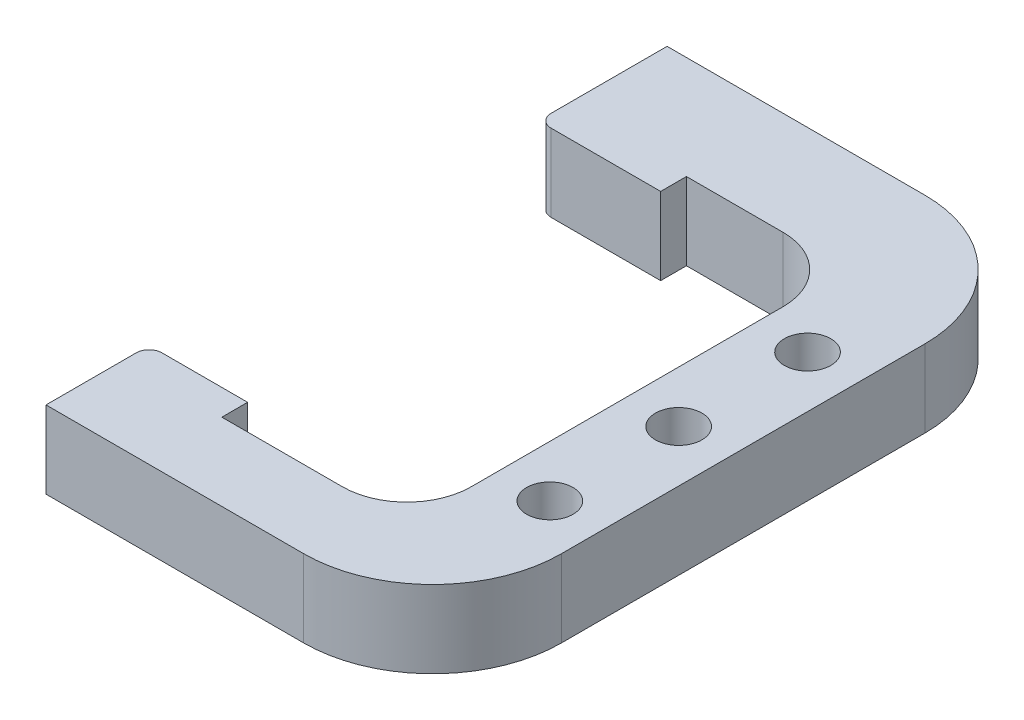
ISO-10303-21;
HEADER;
FILE_DESCRIPTION(('STEP AP214'),'2;1');
FILE_NAME('part.step','',(''),(''),'','','');
FILE_SCHEMA(('AUTOMOTIVE_DESIGN { 1 0 10303 214 1 1 1 1 }'));
ENDSEC;
DATA;
#1=APPLICATION_CONTEXT('core data for automotive mechanical design processes');
#2=APPLICATION_PROTOCOL_DEFINITION('international standard','automotive_design',2000,#1);
#3=PRODUCT_CONTEXT('',#1,'mechanical');
#4=PRODUCT('Part','Part','',(#3));
#5=PRODUCT_RELATED_PRODUCT_CATEGORY('part','',(#4));
#6=PRODUCT_DEFINITION_FORMATION('','',#4);
#7=PRODUCT_DEFINITION_CONTEXT('part definition',#1,'design');
#8=PRODUCT_DEFINITION('design','',#6,#7);
#9=PRODUCT_DEFINITION_SHAPE('','',#8);
#10=(LENGTH_UNIT() NAMED_UNIT(*) SI_UNIT(.MILLI.,.METRE.));
#11=(NAMED_UNIT(*) PLANE_ANGLE_UNIT() SI_UNIT($,.RADIAN.));
#12=(NAMED_UNIT(*) SI_UNIT($,.STERADIAN.) SOLID_ANGLE_UNIT());
#13=UNCERTAINTY_MEASURE_WITH_UNIT(LENGTH_MEASURE(1.E-05),#10,'distance_accuracy_value','');
#14=(GEOMETRIC_REPRESENTATION_CONTEXT(3) GLOBAL_UNCERTAINTY_ASSIGNED_CONTEXT((#13)) GLOBAL_UNIT_ASSIGNED_CONTEXT((#10,
#11,#12)) REPRESENTATION_CONTEXT('',''));
#15=CARTESIAN_POINT('',(0.,0.,0.));
#16=DIRECTION('',(0.,0.,1.));
#17=DIRECTION('',(1.,0.,0.));
#18=AXIS2_PLACEMENT_3D('',#15,#16,#17);
#19=CARTESIAN_POINT('',(30.,6.,36.6));
#20=DIRECTION('',(0.,0.,-1.));
#21=DIRECTION('',(-1.,0.,0.));
#22=AXIS2_PLACEMENT_3D('',#19,#20,#21);
#23=PLANE('',#22);
#24=DIRECTION('',(1.,0.,0.));
#25=VECTOR('',#24,1.);
#26=CARTESIAN_POINT('',(30.,0.,36.6));
#27=LINE('',#26,#25);
#28=CARTESIAN_POINT('',(0.,0.,36.6));
#29=VERTEX_POINT('',#28);
#30=CARTESIAN_POINT('',(20.,0.,36.6));
#31=VERTEX_POINT('',#30);
#32=EDGE_CURVE('E207',#29,#31,#27,.T.);
#33=ORIENTED_EDGE('',*,*,#32,.T.);
#34=DIRECTION('',(0.,-1.,0.));
#35=VECTOR('',#34,1.);
#36=CARTESIAN_POINT('',(20.,6.,36.6));
#37=LINE('',#36,#35);
#38=CARTESIAN_POINT('',(20.,6.,36.6));
#39=VERTEX_POINT('',#38);
#40=EDGE_CURVE('E262',#31,#39,#37,.F.);
#41=ORIENTED_EDGE('',*,*,#40,.T.);
#42=DIRECTION('',(1.,0.,0.));
#43=VECTOR('',#42,1.);
#44=CARTESIAN_POINT('',(30.,6.,36.6));
#45=LINE('',#44,#43);
#46=CARTESIAN_POINT('',(0.,6.,36.6));
#47=VERTEX_POINT('',#46);
#48=EDGE_CURVE('E235',#47,#39,#45,.T.);
#49=ORIENTED_EDGE('',*,*,#48,.F.);
#50=DIRECTION('',(0.,-1.,0.));
#51=VECTOR('',#50,1.);
#52=CARTESIAN_POINT('',(0.,6.,36.6));
#53=LINE('',#52,#51);
#54=EDGE_CURVE('E206',#47,#29,#53,.T.);
#55=ORIENTED_EDGE('',*,*,#54,.T.);
#56=EDGE_LOOP('',(#33,#41,#49,#55));
#57=FACE_BOUND('',#56,.T.);
#58=ADVANCED_FACE('F33',(#57),#23,.F.);
#59=CARTESIAN_POINT('',(30.,6.,-11.6));
#60=DIRECTION('',(-1.,0.,0.));
#61=DIRECTION('',(0.,0.,1.));
#62=AXIS2_PLACEMENT_3D('',#59,#60,#61);
#63=PLANE('',#62);
#64=DIRECTION('',(0.,0.,-1.));
#65=VECTOR('',#64,1.);
#66=CARTESIAN_POINT('',(30.,0.,-11.6));
#67=LINE('',#66,#65);
#68=CARTESIAN_POINT('',(30.,0.,26.6));
#69=VERTEX_POINT('',#68);
#70=CARTESIAN_POINT('',(30.,0.,-1.6));
#71=VERTEX_POINT('',#70);
#72=EDGE_CURVE('E210',#69,#71,#67,.T.);
#73=ORIENTED_EDGE('',*,*,#72,.T.);
#74=DIRECTION('',(0.,-1.,0.));
#75=VECTOR('',#74,1.);
#76=CARTESIAN_POINT('',(30.,6.,-1.6));
#77=LINE('',#76,#75);
#78=CARTESIAN_POINT('',(30.,6.,-1.6));
#79=VERTEX_POINT('',#78);
#80=EDGE_CURVE('E257',#71,#79,#77,.F.);
#81=ORIENTED_EDGE('',*,*,#80,.T.);
#82=DIRECTION('',(0.,0.,-1.));
#83=VECTOR('',#82,1.);
#84=CARTESIAN_POINT('',(30.,6.,-11.6));
#85=LINE('',#84,#83);
#86=CARTESIAN_POINT('',(30.,6.,26.6));
#87=VERTEX_POINT('',#86);
#88=EDGE_CURVE('E169',#87,#79,#85,.T.);
#89=ORIENTED_EDGE('',*,*,#88,.F.);
#90=DIRECTION('',(0.,-1.,0.));
#91=VECTOR('',#90,1.);
#92=CARTESIAN_POINT('',(30.,6.,26.6));
#93=LINE('',#92,#91);
#94=EDGE_CURVE('E254',#87,#69,#93,.T.);
#95=ORIENTED_EDGE('',*,*,#94,.T.);
#96=EDGE_LOOP('',(#73,#81,#89,#95));
#97=FACE_BOUND('',#96,.T.);
#98=ADVANCED_FACE('F315',(#97),#63,.F.);
#99=CARTESIAN_POINT('',(0.,6.,-11.6));
#100=DIRECTION('',(0.,0.,1.));
#101=DIRECTION('',(1.,0.,0.));
#102=AXIS2_PLACEMENT_3D('',#99,#100,#101);
#103=PLANE('',#102);
#104=DIRECTION('',(-1.,0.,0.));
#105=VECTOR('',#104,1.);
#106=CARTESIAN_POINT('',(0.,6.,-11.6));
#107=LINE('',#106,#105);
#108=CARTESIAN_POINT('',(20.,6.,-11.6));
#109=VERTEX_POINT('',#108);
#110=CARTESIAN_POINT('',(0.,6.,-11.6));
#111=VERTEX_POINT('',#110);
#112=EDGE_CURVE('E157',#109,#111,#107,.T.);
#113=ORIENTED_EDGE('',*,*,#112,.F.);
#114=DIRECTION('',(0.,-1.,0.));
#115=VECTOR('',#114,1.);
#116=CARTESIAN_POINT('',(20.,6.,-11.6));
#117=LINE('',#116,#115);
#118=CARTESIAN_POINT('',(20.,0.,-11.6));
#119=VERTEX_POINT('',#118);
#120=EDGE_CURVE('E179',#109,#119,#117,.T.);
#121=ORIENTED_EDGE('',*,*,#120,.T.);
#122=DIRECTION('',(-1.,0.,0.));
#123=VECTOR('',#122,1.);
#124=CARTESIAN_POINT('',(0.,0.,-11.6));
#125=LINE('',#124,#123);
#126=CARTESIAN_POINT('',(0.,0.,-11.6));
#127=VERTEX_POINT('',#126);
#128=EDGE_CURVE('E175',#119,#127,#125,.T.);
#129=ORIENTED_EDGE('',*,*,#128,.T.);
#130=DIRECTION('',(0.,-1.,0.));
#131=VECTOR('',#130,1.);
#132=CARTESIAN_POINT('',(0.,6.,-11.6));
#133=LINE('',#132,#131);
#134=EDGE_CURVE('E172',#111,#127,#133,.T.);
#135=ORIENTED_EDGE('',*,*,#134,.F.);
#136=EDGE_LOOP('',(#113,#121,#129,#135));
#137=FACE_BOUND('',#136,.T.);
#138=ADVANCED_FACE('F173',(#137),#103,.F.);
#139=CARTESIAN_POINT('',(0.,6.,-1.6));
#140=DIRECTION('',(1.,0.,0.));
#141=DIRECTION('',(0.,0.,-1.));
#142=AXIS2_PLACEMENT_3D('',#139,#140,#141);
#143=PLANE('',#142);
#144=DIRECTION('',(0.,0.,1.));
#145=VECTOR('',#144,1.);
#146=CARTESIAN_POINT('',(0.,0.,-1.6));
#147=LINE('',#146,#145);
#148=CARTESIAN_POINT('',(0.,0.,-2.6));
#149=VERTEX_POINT('',#148);
#150=EDGE_CURVE('E215',#127,#149,#147,.T.);
#151=ORIENTED_EDGE('',*,*,#150,.T.);
#152=DIRECTION('',(0.,-1.,0.));
#153=VECTOR('',#152,1.);
#154=CARTESIAN_POINT('',(0.,6.,-2.6));
#155=LINE('',#154,#153);
#156=CARTESIAN_POINT('',(0.,6.,-2.6));
#157=VERTEX_POINT('',#156);
#158=EDGE_CURVE('E184',#149,#157,#155,.F.);
#159=ORIENTED_EDGE('',*,*,#158,.T.);
#160=DIRECTION('',(0.,0.,1.));
#161=VECTOR('',#160,1.);
#162=CARTESIAN_POINT('',(0.,6.,-1.6));
#163=LINE('',#162,#161);
#164=EDGE_CURVE('E161',#111,#157,#163,.T.);
#165=ORIENTED_EDGE('',*,*,#164,.F.);
#166=ORIENTED_EDGE('',*,*,#134,.T.);
#167=EDGE_LOOP('',(#151,#159,#165,#166));
#168=FACE_BOUND('',#167,.T.);
#169=ADVANCED_FACE('F182',(#168),#143,.F.);
#170=CARTESIAN_POINT('',(0.,6.,-1.6));
#171=DIRECTION('',(0.,0.,-1.));
#172=DIRECTION('',(-1.,0.,0.));
#173=AXIS2_PLACEMENT_3D('',#170,#171,#172);
#174=PLANE('',#173);
#175=DIRECTION('',(1.,0.,0.));
#176=VECTOR('',#175,1.);
#177=CARTESIAN_POINT('',(0.,6.,-1.6));
#178=LINE('',#177,#176);
#179=CARTESIAN_POINT('',(1.,6.,-1.6));
#180=VERTEX_POINT('',#179);
#181=CARTESIAN_POINT('',(9.50092943418747,6.,-1.6));
#182=VERTEX_POINT('',#181);
#183=EDGE_CURVE('E185',#180,#182,#178,.T.);
#184=ORIENTED_EDGE('',*,*,#183,.F.);
#185=DIRECTION('',(0.,-1.,0.));
#186=VECTOR('',#185,1.);
#187=CARTESIAN_POINT('',(1.,6.,-1.6));
#188=LINE('',#187,#186);
#189=CARTESIAN_POINT('',(1.,0.,-1.6));
#190=VERTEX_POINT('',#189);
#191=EDGE_CURVE('E282',#180,#190,#188,.T.);
#192=ORIENTED_EDGE('',*,*,#191,.T.);
#193=DIRECTION('',(1.,0.,0.));
#194=VECTOR('',#193,1.);
#195=CARTESIAN_POINT('',(0.,0.,-1.6));
#196=LINE('',#195,#194);
#197=CARTESIAN_POINT('',(9.50092943418747,0.,-1.6));
#198=VERTEX_POINT('',#197);
#199=EDGE_CURVE('E217',#190,#198,#196,.T.);
#200=ORIENTED_EDGE('',*,*,#199,.T.);
#201=DIRECTION('',(0.,-1.,0.));
#202=VECTOR('',#201,1.);
#203=CARTESIAN_POINT('',(9.50092943418747,6.,-1.6));
#204=LINE('',#203,#202);
#205=EDGE_CURVE('E180',#182,#198,#204,.T.);
#206=ORIENTED_EDGE('',*,*,#205,.F.);
#207=EDGE_LOOP('',(#184,#192,#200,#206));
#208=FACE_BOUND('',#207,.T.);
#209=ADVANCED_FACE('F394',(#208),#174,.F.);
#210=CARTESIAN_POINT('',(9.50092943418747,6.,-3.6));
#211=DIRECTION('',(-1.,0.,0.));
#212=DIRECTION('',(0.,0.,1.));
#213=AXIS2_PLACEMENT_3D('',#210,#211,#212);
#214=PLANE('',#213);
#215=DIRECTION('',(0.,0.,-1.));
#216=VECTOR('',#215,1.);
#217=CARTESIAN_POINT('',(9.50092943418747,0.,-3.6));
#218=LINE('',#217,#216);
#219=CARTESIAN_POINT('',(9.50092943418747,0.,-3.6));
#220=VERTEX_POINT('',#219);
#221=EDGE_CURVE('E219',#198,#220,#218,.T.);
#222=ORIENTED_EDGE('',*,*,#221,.T.);
#223=DIRECTION('',(0.,-1.,0.));
#224=VECTOR('',#223,1.);
#225=CARTESIAN_POINT('',(9.50092943418747,6.,-3.6));
#226=LINE('',#225,#224);
#227=CARTESIAN_POINT('',(9.50092943418747,6.,-3.6));
#228=VERTEX_POINT('',#227);
#229=EDGE_CURVE('E244',#228,#220,#226,.T.);
#230=ORIENTED_EDGE('',*,*,#229,.F.);
#231=DIRECTION('',(0.,0.,-1.));
#232=VECTOR('',#231,1.);
#233=CARTESIAN_POINT('',(9.50092943418747,6.,-3.6));
#234=LINE('',#233,#232);
#235=EDGE_CURVE('E187',#182,#228,#234,.T.);
#236=ORIENTED_EDGE('',*,*,#235,.F.);
#237=ORIENTED_EDGE('',*,*,#205,.T.);
#238=EDGE_LOOP('',(#222,#230,#236,#237));
#239=FACE_BOUND('',#238,.T.);
#240=ADVANCED_FACE('F399',(#239),#214,.F.);
#241=CARTESIAN_POINT('',(22.,6.,-3.6));
#242=DIRECTION('',(0.,0.,-1.));
#243=DIRECTION('',(-1.,0.,0.));
#244=AXIS2_PLACEMENT_3D('',#241,#242,#243);
#245=PLANE('',#244);
#246=DIRECTION('',(1.,0.,0.));
#247=VECTOR('',#246,1.);
#248=CARTESIAN_POINT('',(22.,0.,-3.6));
#249=LINE('',#248,#247);
#250=CARTESIAN_POINT('',(17.,0.,-3.6));
#251=VERTEX_POINT('',#250);
#252=EDGE_CURVE('E221',#220,#251,#249,.T.);
#253=ORIENTED_EDGE('',*,*,#252,.T.);
#254=DIRECTION('',(0.,-1.,0.));
#255=VECTOR('',#254,1.);
#256=CARTESIAN_POINT('',(17.,6.,-3.6));
#257=LINE('',#256,#255);
#258=CARTESIAN_POINT('',(17.,6.,-3.6));
#259=VERTEX_POINT('',#258);
#260=EDGE_CURVE('E269',#251,#259,#257,.F.);
#261=ORIENTED_EDGE('',*,*,#260,.T.);
#262=DIRECTION('',(1.,0.,0.));
#263=VECTOR('',#262,1.);
#264=CARTESIAN_POINT('',(22.,6.,-3.6));
#265=LINE('',#264,#263);
#266=EDGE_CURVE('E192',#228,#259,#265,.T.);
#267=ORIENTED_EDGE('',*,*,#266,.F.);
#268=ORIENTED_EDGE('',*,*,#229,.T.);
#269=EDGE_LOOP('',(#253,#261,#267,#268));
#270=FACE_BOUND('',#269,.T.);
#271=ADVANCED_FACE('F438',(#270),#245,.F.);
#272=CARTESIAN_POINT('',(22.,6.,30.6));
#273=DIRECTION('',(1.,0.,0.));
#274=DIRECTION('',(0.,0.,-1.));
#275=AXIS2_PLACEMENT_3D('',#272,#273,#274);
#276=PLANE('',#275);
#277=DIRECTION('',(0.,0.,1.));
#278=VECTOR('',#277,1.);
#279=CARTESIAN_POINT('',(22.,6.,-1.6));
#280=LINE('',#279,#278);
#281=CARTESIAN_POINT('',(22.,6.,1.4));
#282=VERTEX_POINT('',#281);
#283=CARTESIAN_POINT('',(22.,6.,25.6));
#284=VERTEX_POINT('',#283);
#285=EDGE_CURVE('E195',#282,#284,#280,.T.);
#286=ORIENTED_EDGE('',*,*,#285,.F.);
#287=DIRECTION('',(0.,-1.,0.));
#288=VECTOR('',#287,1.);
#289=CARTESIAN_POINT('',(22.,0.,1.4));
#290=LINE('',#289,#288);
#291=CARTESIAN_POINT('',(22.,0.,1.4));
#292=VERTEX_POINT('',#291);
#293=EDGE_CURVE('E266',#282,#292,#290,.T.);
#294=ORIENTED_EDGE('',*,*,#293,.T.);
#295=DIRECTION('',(0.,0.,1.));
#296=VECTOR('',#295,1.);
#297=CARTESIAN_POINT('',(22.,0.,30.6));
#298=LINE('',#297,#296);
#299=CARTESIAN_POINT('',(22.,0.,25.6));
#300=VERTEX_POINT('',#299);
#301=EDGE_CURVE('E224',#292,#300,#298,.T.);
#302=ORIENTED_EDGE('',*,*,#301,.T.);
#303=DIRECTION('',(0.,-1.,0.));
#304=VECTOR('',#303,1.);
#305=CARTESIAN_POINT('',(22.,6.,25.6));
#306=LINE('',#305,#304);
#307=EDGE_CURVE('E264',#300,#284,#306,.F.);
#308=ORIENTED_EDGE('',*,*,#307,.T.);
#309=EDGE_LOOP('',(#286,#294,#302,#308));
#310=FACE_BOUND('',#309,.T.);
#311=ADVANCED_FACE('F408',(#310),#276,.F.);
#312=CARTESIAN_POINT('',(7.64665343280109,6.,30.6));
#313=DIRECTION('',(0.,0.,1.));
#314=DIRECTION('',(1.,0.,0.));
#315=AXIS2_PLACEMENT_3D('',#312,#313,#314);
#316=PLANE('',#315);
#317=DIRECTION('',(-1.,0.,0.));
#318=VECTOR('',#317,1.);
#319=CARTESIAN_POINT('',(7.64665343280109,6.,30.6));
#320=LINE('',#319,#318);
#321=CARTESIAN_POINT('',(17.,6.,30.6));
#322=VERTEX_POINT('',#321);
#323=CARTESIAN_POINT('',(7.64665343280109,6.,30.6));
#324=VERTEX_POINT('',#323);
#325=EDGE_CURVE('E198',#322,#324,#320,.T.);
#326=ORIENTED_EDGE('',*,*,#325,.F.);
#327=DIRECTION('',(0.,-1.,0.));
#328=VECTOR('',#327,1.);
#329=CARTESIAN_POINT('',(17.,0.,30.6));
#330=LINE('',#329,#328);
#331=CARTESIAN_POINT('',(17.,0.,30.6));
#332=VERTEX_POINT('',#331);
#333=EDGE_CURVE('E271',#322,#332,#330,.T.);
#334=ORIENTED_EDGE('',*,*,#333,.T.);
#335=DIRECTION('',(-1.,0.,0.));
#336=VECTOR('',#335,1.);
#337=CARTESIAN_POINT('',(7.64665343280109,0.,30.6));
#338=LINE('',#337,#336);
#339=CARTESIAN_POINT('',(7.64665343280109,0.,30.6));
#340=VERTEX_POINT('',#339);
#341=EDGE_CURVE('E227',#332,#340,#338,.T.);
#342=ORIENTED_EDGE('',*,*,#341,.T.);
#343=DIRECTION('',(0.,-1.,0.));
#344=VECTOR('',#343,1.);
#345=CARTESIAN_POINT('',(7.64665343280109,6.,30.6));
#346=LINE('',#345,#344);
#347=EDGE_CURVE('E241',#324,#340,#346,.T.);
#348=ORIENTED_EDGE('',*,*,#347,.F.);
#349=EDGE_LOOP('',(#326,#334,#342,#348));
#350=FACE_BOUND('',#349,.T.);
#351=ADVANCED_FACE('F417',(#350),#316,.F.);
#352=CARTESIAN_POINT('',(7.64665343280109,6.,28.6));
#353=DIRECTION('',(-1.,0.,0.));
#354=DIRECTION('',(0.,0.,1.));
#355=AXIS2_PLACEMENT_3D('',#352,#353,#354);
#356=PLANE('',#355);
#357=DIRECTION('',(0.,0.,-1.));
#358=VECTOR('',#357,1.);
#359=CARTESIAN_POINT('',(7.64665343280109,0.,28.6));
#360=LINE('',#359,#358);
#361=CARTESIAN_POINT('',(7.64665343280109,0.,28.6));
#362=VERTEX_POINT('',#361);
#363=EDGE_CURVE('E229',#340,#362,#360,.T.);
#364=ORIENTED_EDGE('',*,*,#363,.T.);
#365=DIRECTION('',(0.,-1.,0.));
#366=VECTOR('',#365,1.);
#367=CARTESIAN_POINT('',(7.64665343280109,6.,28.6));
#368=LINE('',#367,#366);
#369=CARTESIAN_POINT('',(7.64665343280109,6.,28.6));
#370=VERTEX_POINT('',#369);
#371=EDGE_CURVE('E238',#370,#362,#368,.T.);
#372=ORIENTED_EDGE('',*,*,#371,.F.);
#373=DIRECTION('',(0.,0.,-1.));
#374=VECTOR('',#373,1.);
#375=CARTESIAN_POINT('',(7.64665343280109,6.,28.6));
#376=LINE('',#375,#374);
#377=EDGE_CURVE('E200',#324,#370,#376,.T.);
#378=ORIENTED_EDGE('',*,*,#377,.F.);
#379=ORIENTED_EDGE('',*,*,#347,.T.);
#380=EDGE_LOOP('',(#364,#372,#378,#379));
#381=FACE_BOUND('',#380,.T.);
#382=ADVANCED_FACE('F422',(#381),#356,.F.);
#383=CARTESIAN_POINT('',(0.,6.,28.6));
#384=DIRECTION('',(0.,0.,1.));
#385=DIRECTION('',(1.,0.,0.));
#386=AXIS2_PLACEMENT_3D('',#383,#384,#385);
#387=PLANE('',#386);
#388=DIRECTION('',(-1.,0.,0.));
#389=VECTOR('',#388,1.);
#390=CARTESIAN_POINT('',(0.,0.,28.6));
#391=LINE('',#390,#389);
#392=CARTESIAN_POINT('',(1.,0.,28.6));
#393=VERTEX_POINT('',#392);
#394=EDGE_CURVE('E231',#362,#393,#391,.T.);
#395=ORIENTED_EDGE('',*,*,#394,.T.);
#396=DIRECTION('',(0.,-1.,0.));
#397=VECTOR('',#396,1.);
#398=CARTESIAN_POINT('',(1.,6.,28.6));
#399=LINE('',#398,#397);
#400=CARTESIAN_POINT('',(1.,6.,28.6));
#401=VERTEX_POINT('',#400);
#402=EDGE_CURVE('E11',#393,#401,#399,.F.);
#403=ORIENTED_EDGE('',*,*,#402,.T.);
#404=DIRECTION('',(-1.,0.,0.));
#405=VECTOR('',#404,1.);
#406=CARTESIAN_POINT('',(0.,6.,28.6));
#407=LINE('',#406,#405);
#408=EDGE_CURVE('E202',#370,#401,#407,.T.);
#409=ORIENTED_EDGE('',*,*,#408,.F.);
#410=ORIENTED_EDGE('',*,*,#371,.T.);
#411=EDGE_LOOP('',(#395,#403,#409,#410));
#412=FACE_BOUND('',#411,.T.);
#413=ADVANCED_FACE('F423',(#412),#387,.F.);
#414=CARTESIAN_POINT('',(0.,6.,36.6));
#415=DIRECTION('',(1.,0.,0.));
#416=DIRECTION('',(0.,0.,-1.));
#417=AXIS2_PLACEMENT_3D('',#414,#415,#416);
#418=PLANE('',#417);
#419=DIRECTION('',(0.,0.,1.));
#420=VECTOR('',#419,1.);
#421=CARTESIAN_POINT('',(0.,6.,36.6));
#422=LINE('',#421,#420);
#423=CARTESIAN_POINT('',(0.,6.,29.6));
#424=VERTEX_POINT('',#423);
#425=EDGE_CURVE('E204',#424,#47,#422,.T.);
#426=ORIENTED_EDGE('',*,*,#425,.F.);
#427=DIRECTION('',(0.,-1.,0.));
#428=VECTOR('',#427,1.);
#429=CARTESIAN_POINT('',(0.,6.,29.6));
#430=LINE('',#429,#428);
#431=CARTESIAN_POINT('',(0.,0.,29.6));
#432=VERTEX_POINT('',#431);
#433=EDGE_CURVE('E41',#424,#432,#430,.T.);
#434=ORIENTED_EDGE('',*,*,#433,.T.);
#435=DIRECTION('',(0.,0.,1.));
#436=VECTOR('',#435,1.);
#437=CARTESIAN_POINT('',(0.,0.,36.6));
#438=LINE('',#437,#436);
#439=EDGE_CURVE('E233',#432,#29,#438,.T.);
#440=ORIENTED_EDGE('',*,*,#439,.T.);
#441=ORIENTED_EDGE('',*,*,#54,.F.);
#442=EDGE_LOOP('',(#426,#434,#440,#441));
#443=FACE_BOUND('',#442,.T.);
#444=ADVANCED_FACE('F296',(#443),#418,.F.);
#445=CARTESIAN_POINT('',(0.,6.,0.));
#446=DIRECTION('',(0.,-1.,0.));
#447=DIRECTION('',(0.,0.,-1.));
#448=AXIS2_PLACEMENT_3D('',#445,#446,#447);
#449=PLANE('',#448);
#450=CARTESIAN_POINT('',(26.,6.,3.5));
#451=DIRECTION('',(0.,1.,0.));
#452=DIRECTION('',(0.,0.,1.));
#453=AXIS2_PLACEMENT_3D('',#450,#451,#452);
#454=CIRCLE('',#453,1.80330947751328);
#455=CARTESIAN_POINT('',(26.,6.,5.30330947751328));
#456=VERTEX_POINT('',#455);
#457=EDGE_CURVE('E331',#456,#456,#454,.T.);
#458=ORIENTED_EDGE('',*,*,#457,.F.);
#459=EDGE_LOOP('',(#458));
#460=FACE_BOUND('',#459,.T.);
#461=CARTESIAN_POINT('',(26.,6.,23.5));
#462=DIRECTION('',(0.,1.,0.));
#463=DIRECTION('',(0.,0.,1.));
#464=AXIS2_PLACEMENT_3D('',#461,#462,#463);
#465=CIRCLE('',#464,1.80330947751328);
#466=CARTESIAN_POINT('',(26.,6.,25.3033094775133));
#467=VERTEX_POINT('',#466);
#468=EDGE_CURVE('E325',#467,#467,#465,.T.);
#469=ORIENTED_EDGE('',*,*,#468,.F.);
#470=EDGE_LOOP('',(#469));
#471=FACE_BOUND('',#470,.T.);
#472=CARTESIAN_POINT('',(26.,6.,13.5));
#473=DIRECTION('',(0.,1.,0.));
#474=DIRECTION('',(0.,0.,1.));
#475=AXIS2_PLACEMENT_3D('',#472,#473,#474);
#476=CIRCLE('',#475,1.80330947751328);
#477=CARTESIAN_POINT('',(26.,6.,15.3033094775133));
#478=VERTEX_POINT('',#477);
#479=EDGE_CURVE('E319',#478,#478,#476,.T.);
#480=ORIENTED_EDGE('',*,*,#479,.F.);
#481=EDGE_LOOP('',(#480));
#482=FACE_BOUND('',#481,.T.);
#483=ORIENTED_EDGE('',*,*,#164,.T.);
#484=CARTESIAN_POINT('',(1.,6.,-2.6));
#485=DIRECTION('',(0.,-1.,0.));
#486=DIRECTION('',(0.,0.,-1.));
#487=AXIS2_PLACEMENT_3D('',#484,#485,#486);
#488=CIRCLE('',#487,1.);
#489=EDGE_CURVE('E291',#157,#180,#488,.F.);
#490=ORIENTED_EDGE('',*,*,#489,.T.);
#491=ORIENTED_EDGE('',*,*,#183,.T.);
#492=ORIENTED_EDGE('',*,*,#235,.T.);
#493=ORIENTED_EDGE('',*,*,#266,.T.);
#494=CARTESIAN_POINT('',(17.,6.,1.4));
#495=DIRECTION('',(0.,-1.,0.));
#496=DIRECTION('',(0.,0.,-1.));
#497=AXIS2_PLACEMENT_3D('',#494,#495,#496);
#498=CIRCLE('',#497,5.);
#499=EDGE_CURVE('E276',#259,#282,#498,.T.);
#500=ORIENTED_EDGE('',*,*,#499,.T.);
#501=ORIENTED_EDGE('',*,*,#285,.T.);
#502=CARTESIAN_POINT('',(17.,6.,25.6));
#503=DIRECTION('',(0.,-1.,0.));
#504=DIRECTION('',(0.,0.,-1.));
#505=AXIS2_PLACEMENT_3D('',#502,#503,#504);
#506=CIRCLE('',#505,5.);
#507=EDGE_CURVE('E280',#284,#322,#506,.T.);
#508=ORIENTED_EDGE('',*,*,#507,.T.);
#509=ORIENTED_EDGE('',*,*,#325,.T.);
#510=ORIENTED_EDGE('',*,*,#377,.T.);
#511=ORIENTED_EDGE('',*,*,#408,.T.);
#512=CARTESIAN_POINT('',(1.,6.,29.6));
#513=DIRECTION('',(0.,-1.,0.));
#514=DIRECTION('',(0.,0.,-1.));
#515=AXIS2_PLACEMENT_3D('',#512,#513,#514);
#516=CIRCLE('',#515,1.);
#517=EDGE_CURVE('E48',#401,#424,#516,.F.);
#518=ORIENTED_EDGE('',*,*,#517,.T.);
#519=ORIENTED_EDGE('',*,*,#425,.T.);
#520=ORIENTED_EDGE('',*,*,#48,.T.);
#521=CARTESIAN_POINT('',(20.,6.,26.6));
#522=DIRECTION('',(0.,-1.,0.));
#523=DIRECTION('',(0.,0.,-1.));
#524=AXIS2_PLACEMENT_3D('',#521,#522,#523);
#525=CIRCLE('',#524,10.);
#526=EDGE_CURVE('E259',#39,#87,#525,.F.);
#527=ORIENTED_EDGE('',*,*,#526,.T.);
#528=ORIENTED_EDGE('',*,*,#88,.T.);
#529=CARTESIAN_POINT('',(20.,6.,-1.6));
#530=DIRECTION('',(0.,-1.,0.));
#531=DIRECTION('',(0.,0.,-1.));
#532=AXIS2_PLACEMENT_3D('',#529,#530,#531);
#533=CIRCLE('',#532,10.);
#534=EDGE_CURVE('E165',#79,#109,#533,.F.);
#535=ORIENTED_EDGE('',*,*,#534,.T.);
#536=ORIENTED_EDGE('',*,*,#112,.T.);
#537=EDGE_LOOP('',(#483,#490,#491,#492,#493,#500,#501,#508,#509,#510,#511,#518,#519,#520,#527,
#528,#535,#536));
#538=FACE_BOUND('',#537,.T.);
#539=ADVANCED_FACE('F159',(#460,#471,#482,#538),#449,.F.);
#540=CARTESIAN_POINT('',(0.,0.,0.));
#541=DIRECTION('',(0.,-1.,0.));
#542=DIRECTION('',(0.,0.,-1.));
#543=AXIS2_PLACEMENT_3D('',#540,#541,#542);
#544=PLANE('',#543);
#545=CARTESIAN_POINT('',(26.,0.,3.5));
#546=DIRECTION('',(0.,1.,0.));
#547=DIRECTION('',(0.,0.,1.));
#548=AXIS2_PLACEMENT_3D('',#545,#546,#547);
#549=CIRCLE('',#548,1.80330947751328);
#550=CARTESIAN_POINT('',(26.,0.,5.30330947751328));
#551=VERTEX_POINT('',#550);
#552=EDGE_CURVE('E328',#551,#551,#549,.T.);
#553=ORIENTED_EDGE('',*,*,#552,.T.);
#554=EDGE_LOOP('',(#553));
#555=FACE_BOUND('',#554,.T.);
#556=CARTESIAN_POINT('',(26.,0.,23.5));
#557=DIRECTION('',(0.,1.,0.));
#558=DIRECTION('',(0.,0.,1.));
#559=AXIS2_PLACEMENT_3D('',#556,#557,#558);
#560=CIRCLE('',#559,1.80330947751328);
#561=CARTESIAN_POINT('',(26.,0.,25.3033094775133));
#562=VERTEX_POINT('',#561);
#563=EDGE_CURVE('E322',#562,#562,#560,.T.);
#564=ORIENTED_EDGE('',*,*,#563,.T.);
#565=EDGE_LOOP('',(#564));
#566=FACE_BOUND('',#565,.T.);
#567=CARTESIAN_POINT('',(26.,0.,13.5));
#568=DIRECTION('',(0.,1.,0.));
#569=DIRECTION('',(0.,0.,1.));
#570=AXIS2_PLACEMENT_3D('',#567,#568,#569);
#571=CIRCLE('',#570,1.80330947751328);
#572=CARTESIAN_POINT('',(26.,0.,15.3033094775133));
#573=VERTEX_POINT('',#572);
#574=EDGE_CURVE('E211',#573,#573,#571,.T.);
#575=ORIENTED_EDGE('',*,*,#574,.T.);
#576=EDGE_LOOP('',(#575));
#577=FACE_BOUND('',#576,.T.);
#578=ORIENTED_EDGE('',*,*,#199,.F.);
#579=CARTESIAN_POINT('',(1.,0.,-2.6));
#580=DIRECTION('',(0.,-1.,0.));
#581=DIRECTION('',(0.,0.,-1.));
#582=AXIS2_PLACEMENT_3D('',#579,#580,#581);
#583=CIRCLE('',#582,1.);
#584=EDGE_CURVE('E287',#190,#149,#583,.T.);
#585=ORIENTED_EDGE('',*,*,#584,.T.);
#586=ORIENTED_EDGE('',*,*,#150,.F.);
#587=ORIENTED_EDGE('',*,*,#128,.F.);
#588=CARTESIAN_POINT('',(20.,0.,-1.6));
#589=DIRECTION('',(0.,-1.,0.));
#590=DIRECTION('',(0.,0.,-1.));
#591=AXIS2_PLACEMENT_3D('',#588,#589,#590);
#592=CIRCLE('',#591,10.);
#593=EDGE_CURVE('E252',#119,#71,#592,.T.);
#594=ORIENTED_EDGE('',*,*,#593,.T.);
#595=ORIENTED_EDGE('',*,*,#72,.F.);
#596=CARTESIAN_POINT('',(20.,0.,26.6));
#597=DIRECTION('',(0.,-1.,0.));
#598=DIRECTION('',(0.,0.,-1.));
#599=AXIS2_PLACEMENT_3D('',#596,#597,#598);
#600=CIRCLE('',#599,10.);
#601=EDGE_CURVE('E250',#69,#31,#600,.T.);
#602=ORIENTED_EDGE('',*,*,#601,.T.);
#603=ORIENTED_EDGE('',*,*,#32,.F.);
#604=ORIENTED_EDGE('',*,*,#439,.F.);
#605=CARTESIAN_POINT('',(1.,0.,29.6));
#606=DIRECTION('',(0.,-1.,0.));
#607=DIRECTION('',(0.,0.,-1.));
#608=AXIS2_PLACEMENT_3D('',#605,#606,#607);
#609=CIRCLE('',#608,1.);
#610=EDGE_CURVE('E285',#432,#393,#609,.T.);
#611=ORIENTED_EDGE('',*,*,#610,.T.);
#612=ORIENTED_EDGE('',*,*,#394,.F.);
#613=ORIENTED_EDGE('',*,*,#363,.F.);
#614=ORIENTED_EDGE('',*,*,#341,.F.);
#615=CARTESIAN_POINT('',(17.,0.,25.6));
#616=DIRECTION('',(0.,-1.,0.));
#617=DIRECTION('',(0.,0.,-1.));
#618=AXIS2_PLACEMENT_3D('',#615,#616,#617);
#619=CIRCLE('',#618,5.);
#620=EDGE_CURVE('E278',#332,#300,#619,.F.);
#621=ORIENTED_EDGE('',*,*,#620,.T.);
#622=ORIENTED_EDGE('',*,*,#301,.F.);
#623=CARTESIAN_POINT('',(17.,0.,1.4));
#624=DIRECTION('',(0.,-1.,0.));
#625=DIRECTION('',(0.,0.,-1.));
#626=AXIS2_PLACEMENT_3D('',#623,#624,#625);
#627=CIRCLE('',#626,5.);
#628=EDGE_CURVE('E274',#292,#251,#627,.F.);
#629=ORIENTED_EDGE('',*,*,#628,.T.);
#630=ORIENTED_EDGE('',*,*,#252,.F.);
#631=ORIENTED_EDGE('',*,*,#221,.F.);
#632=EDGE_LOOP('',(#578,#585,#586,#587,#594,#595,#602,#603,#604,#611,#612,#613,#614,#621,#622,
#629,#630,#631));
#633=FACE_BOUND('',#632,.T.);
#634=ADVANCED_FACE('F302',(#555,#566,#577,#633),#544,.T.);
#635=CARTESIAN_POINT('',(20.,6.,-1.6));
#636=DIRECTION('',(0.,-1.,0.));
#637=DIRECTION('',(0.,0.,-1.));
#638=AXIS2_PLACEMENT_3D('',#635,#636,#637);
#639=CYLINDRICAL_SURFACE('',#638,10.);
#640=ORIENTED_EDGE('',*,*,#534,.F.);
#641=ORIENTED_EDGE('',*,*,#80,.F.);
#642=ORIENTED_EDGE('',*,*,#593,.F.);
#643=ORIENTED_EDGE('',*,*,#120,.F.);
#644=EDGE_LOOP('',(#640,#641,#642,#643));
#645=FACE_BOUND('',#644,.T.);
#646=ADVANCED_FACE('F373',(#645),#639,.T.);
#647=CARTESIAN_POINT('',(20.,6.,26.6));
#648=DIRECTION('',(0.,-1.,0.));
#649=DIRECTION('',(0.,0.,-1.));
#650=AXIS2_PLACEMENT_3D('',#647,#648,#649);
#651=CYLINDRICAL_SURFACE('',#650,10.);
#652=ORIENTED_EDGE('',*,*,#526,.F.);
#653=ORIENTED_EDGE('',*,*,#40,.F.);
#654=ORIENTED_EDGE('',*,*,#601,.F.);
#655=ORIENTED_EDGE('',*,*,#94,.F.);
#656=EDGE_LOOP('',(#652,#653,#654,#655));
#657=FACE_BOUND('',#656,.T.);
#658=ADVANCED_FACE('F311',(#657),#651,.T.);
#659=CARTESIAN_POINT('',(17.,6.,1.4));
#660=DIRECTION('',(0.,1.,0.));
#661=DIRECTION('',(0.,0.,1.));
#662=AXIS2_PLACEMENT_3D('',#659,#660,#661);
#663=CYLINDRICAL_SURFACE('',#662,5.);
#664=ORIENTED_EDGE('',*,*,#499,.F.);
#665=ORIENTED_EDGE('',*,*,#260,.F.);
#666=ORIENTED_EDGE('',*,*,#628,.F.);
#667=ORIENTED_EDGE('',*,*,#293,.F.);
#668=EDGE_LOOP('',(#664,#665,#666,#667));
#669=FACE_BOUND('',#668,.T.);
#670=ADVANCED_FACE('F379',(#669),#663,.F.);
#671=CARTESIAN_POINT('',(17.,6.,25.6));
#672=DIRECTION('',(0.,1.,0.));
#673=DIRECTION('',(0.,0.,1.));
#674=AXIS2_PLACEMENT_3D('',#671,#672,#673);
#675=CYLINDRICAL_SURFACE('',#674,5.);
#676=ORIENTED_EDGE('',*,*,#507,.F.);
#677=ORIENTED_EDGE('',*,*,#307,.F.);
#678=ORIENTED_EDGE('',*,*,#620,.F.);
#679=ORIENTED_EDGE('',*,*,#333,.F.);
#680=EDGE_LOOP('',(#676,#677,#678,#679));
#681=FACE_BOUND('',#680,.T.);
#682=ADVANCED_FACE('F382',(#681),#675,.F.);
#683=CARTESIAN_POINT('',(1.,6.,-2.6));
#684=DIRECTION('',(0.,-1.,0.));
#685=DIRECTION('',(0.,0.,-1.));
#686=AXIS2_PLACEMENT_3D('',#683,#684,#685);
#687=CYLINDRICAL_SURFACE('',#686,1.);
#688=ORIENTED_EDGE('',*,*,#489,.F.);
#689=ORIENTED_EDGE('',*,*,#158,.F.);
#690=ORIENTED_EDGE('',*,*,#584,.F.);
#691=ORIENTED_EDGE('',*,*,#191,.F.);
#692=EDGE_LOOP('',(#688,#689,#690,#691));
#693=FACE_BOUND('',#692,.T.);
#694=ADVANCED_FACE('F363',(#693),#687,.T.);
#695=CARTESIAN_POINT('',(1.,6.,29.6));
#696=DIRECTION('',(0.,-1.,0.));
#697=DIRECTION('',(0.,0.,-1.));
#698=AXIS2_PLACEMENT_3D('',#695,#696,#697);
#699=CYLINDRICAL_SURFACE('',#698,1.);
#700=ORIENTED_EDGE('',*,*,#517,.F.);
#701=ORIENTED_EDGE('',*,*,#402,.F.);
#702=ORIENTED_EDGE('',*,*,#610,.F.);
#703=ORIENTED_EDGE('',*,*,#433,.F.);
#704=EDGE_LOOP('',(#700,#701,#702,#703));
#705=FACE_BOUND('',#704,.T.);
#706=ADVANCED_FACE('F35',(#705),#699,.T.);
#707=CARTESIAN_POINT('',(26.,0.,13.5));
#708=DIRECTION('',(0.,1.,0.));
#709=DIRECTION('',(0.,0.,1.));
#710=AXIS2_PLACEMENT_3D('',#707,#708,#709);
#711=CYLINDRICAL_SURFACE('',#710,1.80330947751328);
#712=ORIENTED_EDGE('',*,*,#574,.F.);
#713=EDGE_LOOP('',(#712));
#714=FACE_BOUND('',#713,.T.);
#715=ORIENTED_EDGE('',*,*,#479,.T.);
#716=EDGE_LOOP('',(#715));
#717=FACE_BOUND('',#716,.T.);
#718=ADVANCED_FACE('F353',(#714,#717),#711,.F.);
#719=CARTESIAN_POINT('',(26.,0.,23.5));
#720=DIRECTION('',(0.,1.,0.));
#721=DIRECTION('',(0.,0.,1.));
#722=AXIS2_PLACEMENT_3D('',#719,#720,#721);
#723=CYLINDRICAL_SURFACE('',#722,1.80330947751328);
#724=ORIENTED_EDGE('',*,*,#563,.F.);
#725=EDGE_LOOP('',(#724));
#726=FACE_BOUND('',#725,.T.);
#727=ORIENTED_EDGE('',*,*,#468,.T.);
#728=EDGE_LOOP('',(#727));
#729=FACE_BOUND('',#728,.T.);
#730=ADVANCED_FACE('F342',(#726,#729),#723,.F.);
#731=CARTESIAN_POINT('',(26.,0.,3.5));
#732=DIRECTION('',(0.,1.,0.));
#733=DIRECTION('',(0.,0.,1.));
#734=AXIS2_PLACEMENT_3D('',#731,#732,#733);
#735=CYLINDRICAL_SURFACE('',#734,1.80330947751328);
#736=ORIENTED_EDGE('',*,*,#552,.F.);
#737=EDGE_LOOP('',(#736));
#738=FACE_BOUND('',#737,.T.);
#739=ORIENTED_EDGE('',*,*,#457,.T.);
#740=EDGE_LOOP('',(#739));
#741=FACE_BOUND('',#740,.T.);
#742=ADVANCED_FACE('F339',(#738,#741),#735,.F.);
#743=CLOSED_SHELL('',(#58,#98,#138,#169,#209,#240,#271,#311,#351,#382,#413,#444,#539,#634,#646,
#658,#670,#682,#694,#706,#718,#730,#742));
#744=MANIFOLD_SOLID_BREP('B2',#743);
#745=ADVANCED_BREP_SHAPE_REPRESENTATION('',(#18,#744),#14);
#746=SHAPE_DEFINITION_REPRESENTATION(#9,#745);
ENDSEC;
END-ISO-10303-21;
